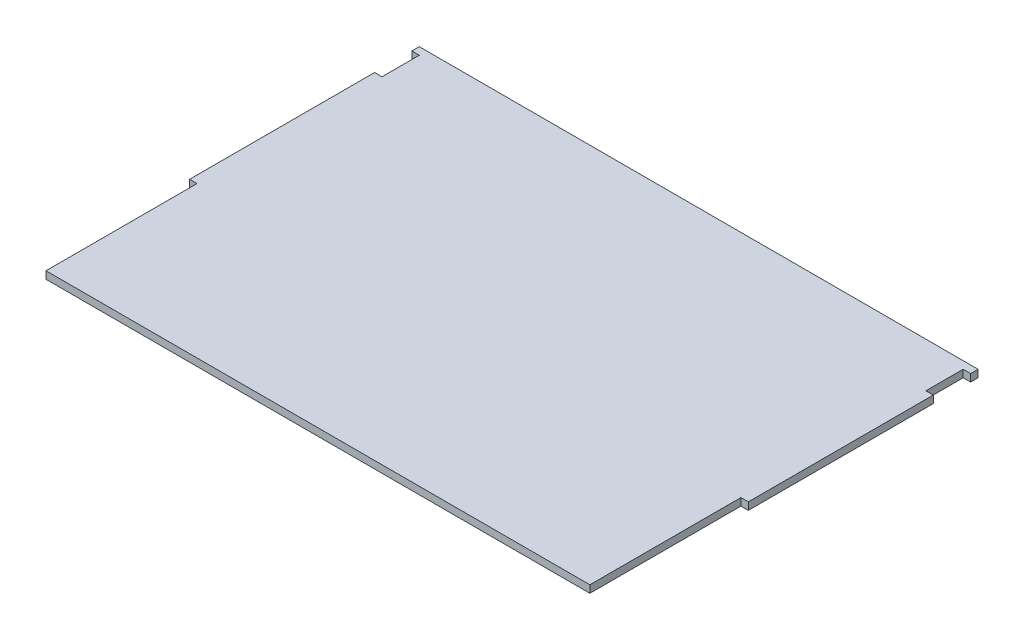
ISO-10303-21;
HEADER;
FILE_DESCRIPTION(('STEP AP214'),'2;1');
FILE_NAME('part.step','',(''),(''),'','','');
FILE_SCHEMA(('AUTOMOTIVE_DESIGN { 1 0 10303 214 1 1 1 1 }'));
ENDSEC;
DATA;
#1=APPLICATION_CONTEXT('core data for automotive mechanical design processes');
#2=APPLICATION_PROTOCOL_DEFINITION('international standard','automotive_design',2000,#1);
#3=PRODUCT_CONTEXT('',#1,'mechanical');
#4=PRODUCT('Part','Part','',(#3));
#5=PRODUCT_RELATED_PRODUCT_CATEGORY('part','',(#4));
#6=PRODUCT_DEFINITION_FORMATION('','',#4);
#7=PRODUCT_DEFINITION_CONTEXT('part definition',#1,'design');
#8=PRODUCT_DEFINITION('design','',#6,#7);
#9=PRODUCT_DEFINITION_SHAPE('','',#8);
#10=(LENGTH_UNIT() NAMED_UNIT(*) SI_UNIT(.MILLI.,.METRE.));
#11=(NAMED_UNIT(*) PLANE_ANGLE_UNIT() SI_UNIT($,.RADIAN.));
#12=(NAMED_UNIT(*) SI_UNIT($,.STERADIAN.) SOLID_ANGLE_UNIT());
#13=UNCERTAINTY_MEASURE_WITH_UNIT(LENGTH_MEASURE(1.E-05),#10,'distance_accuracy_value','');
#14=(GEOMETRIC_REPRESENTATION_CONTEXT(3) GLOBAL_UNCERTAINTY_ASSIGNED_CONTEXT((#13)) GLOBAL_UNIT_ASSIGNED_CONTEXT((#10,
#11,#12)) REPRESENTATION_CONTEXT('',''));
#15=CARTESIAN_POINT('',(0.,0.,0.));
#16=DIRECTION('',(0.,0.,1.));
#17=DIRECTION('',(1.,0.,0.));
#18=AXIS2_PLACEMENT_3D('',#15,#16,#17);
#19=CARTESIAN_POINT('',(220.,3.,0.));
#20=DIRECTION('',(-1.,0.,0.));
#21=DIRECTION('',(0.,0.,1.));
#22=AXIS2_PLACEMENT_3D('',#19,#20,#21);
#23=PLANE('',#22);
#24=DIRECTION('',(0.,0.,-1.));
#25=VECTOR('',#24,1.);
#26=CARTESIAN_POINT('',(220.,3.,0.));
#27=LINE('',#26,#25);
#28=CARTESIAN_POINT('',(220.,3.,-135.910780355686));
#29=VERTEX_POINT('',#28);
#30=CARTESIAN_POINT('',(220.,3.,-151.));
#31=VERTEX_POINT('',#30);
#32=EDGE_CURVE('E48',#29,#31,#27,.T.);
#33=ORIENTED_EDGE('',*,*,#32,.F.);
#34=DIRECTION('',(0.,1.,0.));
#35=VECTOR('',#34,1.);
#36=CARTESIAN_POINT('',(219.999999999992,-74.8827384605226,-135.910780355686));
#37=LINE('',#36,#35);
#38=CARTESIAN_POINT('',(219.999999999992,0.,-135.910780355686));
#39=VERTEX_POINT('',#38);
#40=EDGE_CURVE('E158',#39,#29,#37,.T.);
#41=ORIENTED_EDGE('',*,*,#40,.F.);
#42=DIRECTION('',(0.,0.,-1.));
#43=VECTOR('',#42,1.);
#44=CARTESIAN_POINT('',(220.,0.,0.));
#45=LINE('',#44,#43);
#46=CARTESIAN_POINT('',(220.,0.,-151.));
#47=VERTEX_POINT('',#46);
#48=EDGE_CURVE('E156',#39,#47,#45,.T.);
#49=ORIENTED_EDGE('',*,*,#48,.T.);
#50=DIRECTION('',(0.,-1.,0.));
#51=VECTOR('',#50,1.);
#52=CARTESIAN_POINT('',(220.,3.,-151.));
#53=LINE('',#52,#51);
#54=EDGE_CURVE('E262',#31,#47,#53,.T.);
#55=ORIENTED_EDGE('',*,*,#54,.F.);
#56=EDGE_LOOP('',(#33,#41,#49,#55));
#57=FACE_BOUND('',#56,.T.);
#58=ADVANCED_FACE('F33',(#57),#23,.F.);
#59=CARTESIAN_POINT('',(0.,3.,0.));
#60=DIRECTION('',(1.,0.,0.));
#61=DIRECTION('',(0.,0.,-1.));
#62=AXIS2_PLACEMENT_3D('',#59,#60,#61);
#63=PLANE('',#62);
#64=DIRECTION('',(0.,0.,1.));
#65=VECTOR('',#64,1.);
#66=CARTESIAN_POINT('',(0.,0.,0.));
#67=LINE('',#66,#65);
#68=CARTESIAN_POINT('',(0.,0.,-151.));
#69=VERTEX_POINT('',#68);
#70=CARTESIAN_POINT('',(0.,0.,-135.910780355691));
#71=VERTEX_POINT('',#70);
#72=EDGE_CURVE('E231',#69,#71,#67,.T.);
#73=ORIENTED_EDGE('',*,*,#72,.T.);
#74=DIRECTION('',(0.,1.,0.));
#75=VECTOR('',#74,1.);
#76=CARTESIAN_POINT('',(6.68735899989059E-13,-74.8827384605226,-135.910780355691));
#77=LINE('',#76,#75);
#78=CARTESIAN_POINT('',(0.,3.,-135.910780355691));
#79=VERTEX_POINT('',#78);
#80=EDGE_CURVE('E188',#71,#79,#77,.T.);
#81=ORIENTED_EDGE('',*,*,#80,.T.);
#82=DIRECTION('',(0.,0.,1.));
#83=VECTOR('',#82,1.);
#84=CARTESIAN_POINT('',(0.,3.,0.));
#85=LINE('',#84,#83);
#86=CARTESIAN_POINT('',(0.,3.,-151.));
#87=VERTEX_POINT('',#86);
#88=EDGE_CURVE('E212',#87,#79,#85,.T.);
#89=ORIENTED_EDGE('',*,*,#88,.F.);
#90=DIRECTION('',(0.,-1.,0.));
#91=VECTOR('',#90,1.);
#92=CARTESIAN_POINT('',(0.,3.,-151.));
#93=LINE('',#92,#91);
#94=EDGE_CURVE('E230',#87,#69,#93,.T.);
#95=ORIENTED_EDGE('',*,*,#94,.T.);
#96=EDGE_LOOP('',(#73,#81,#89,#95));
#97=FACE_BOUND('',#96,.T.);
#98=ADVANCED_FACE('F327',(#97),#63,.F.);
#99=CARTESIAN_POINT('',(0.,3.,-61.0881599835933));
#100=VERTEX_POINT('',#99);
#101=CARTESIAN_POINT('',(0.,3.,0.));
#102=VERTEX_POINT('',#101);
#103=EDGE_CURVE('E216',#100,#102,#85,.T.);
#104=ORIENTED_EDGE('',*,*,#103,.F.);
#105=DIRECTION('',(0.,1.,0.));
#106=VECTOR('',#105,1.);
#107=CARTESIAN_POINT('',(2.64545330086463E-13,-74.8827384605226,-61.0881599835933));
#108=LINE('',#107,#106);
#109=CARTESIAN_POINT('',(2.64545330086463E-13,0.,-61.0881599835933));
#110=VERTEX_POINT('',#109);
#111=EDGE_CURVE('E197',#110,#100,#108,.T.);
#112=ORIENTED_EDGE('',*,*,#111,.F.);
#113=CARTESIAN_POINT('',(0.,0.,0.));
#114=VERTEX_POINT('',#113);
#115=EDGE_CURVE('E211',#110,#114,#67,.T.);
#116=ORIENTED_EDGE('',*,*,#115,.T.);
#117=DIRECTION('',(0.,-1.,0.));
#118=VECTOR('',#117,1.);
#119=CARTESIAN_POINT('',(0.,3.,0.));
#120=LINE('',#119,#118);
#121=EDGE_CURVE('E11',#102,#114,#120,.T.);
#122=ORIENTED_EDGE('',*,*,#121,.F.);
#123=EDGE_LOOP('',(#104,#112,#116,#122));
#124=FACE_BOUND('',#123,.T.);
#125=ADVANCED_FACE('F35',(#124),#63,.F.);
#126=CARTESIAN_POINT('',(0.,3.,0.));
#127=DIRECTION('',(0.,0.,-1.));
#128=DIRECTION('',(-1.,0.,0.));
#129=AXIS2_PLACEMENT_3D('',#126,#127,#128);
#130=PLANE('',#129);
#131=DIRECTION('',(1.,0.,0.));
#132=VECTOR('',#131,1.);
#133=CARTESIAN_POINT('',(0.,0.,0.));
#134=LINE('',#133,#132);
#135=CARTESIAN_POINT('',(220.,0.,0.));
#136=VERTEX_POINT('',#135);
#137=EDGE_CURVE('E233',#114,#136,#134,.T.);
#138=ORIENTED_EDGE('',*,*,#137,.T.);
#139=DIRECTION('',(0.,-1.,0.));
#140=VECTOR('',#139,1.);
#141=CARTESIAN_POINT('',(220.,3.,0.));
#142=LINE('',#141,#140);
#143=CARTESIAN_POINT('',(220.,3.,0.));
#144=VERTEX_POINT('',#143);
#145=EDGE_CURVE('E41',#144,#136,#142,.T.);
#146=ORIENTED_EDGE('',*,*,#145,.F.);
#147=DIRECTION('',(1.,0.,0.));
#148=VECTOR('',#147,1.);
#149=CARTESIAN_POINT('',(0.,3.,0.));
#150=LINE('',#149,#148);
#151=EDGE_CURVE('E215',#102,#144,#150,.T.);
#152=ORIENTED_EDGE('',*,*,#151,.F.);
#153=ORIENTED_EDGE('',*,*,#121,.T.);
#154=EDGE_LOOP('',(#138,#146,#152,#153));
#155=FACE_BOUND('',#154,.T.);
#156=ADVANCED_FACE('F318',(#155),#130,.F.);
#157=CARTESIAN_POINT('',(220.,0.,-61.0881599835888));
#158=VERTEX_POINT('',#157);
#159=EDGE_CURVE('E235',#136,#158,#45,.T.);
#160=ORIENTED_EDGE('',*,*,#159,.T.);
#161=DIRECTION('',(0.,1.,0.));
#162=VECTOR('',#161,1.);
#163=CARTESIAN_POINT('',(219.999999999991,-74.8827384605226,-61.0881599835888));
#164=LINE('',#163,#162);
#165=CARTESIAN_POINT('',(220.,3.,-61.0881599835888));
#166=VERTEX_POINT('',#165);
#167=EDGE_CURVE('E56',#158,#166,#164,.T.);
#168=ORIENTED_EDGE('',*,*,#167,.T.);
#169=EDGE_CURVE('E218',#144,#166,#27,.T.);
#170=ORIENTED_EDGE('',*,*,#169,.F.);
#171=ORIENTED_EDGE('',*,*,#145,.T.);
#172=EDGE_LOOP('',(#160,#168,#170,#171));
#173=FACE_BOUND('',#172,.T.);
#174=ADVANCED_FACE('F267',(#173),#23,.F.);
#175=CARTESIAN_POINT('',(223.,3.,-151.));
#176=DIRECTION('',(0.,0.,-1.));
#177=DIRECTION('',(-1.,0.,0.));
#178=AXIS2_PLACEMENT_3D('',#175,#176,#177);
#179=PLANE('',#178);
#180=DIRECTION('',(1.,0.,0.));
#181=VECTOR('',#180,1.);
#182=CARTESIAN_POINT('',(223.,0.,-151.));
#183=LINE('',#182,#181);
#184=CARTESIAN_POINT('',(223.,0.,-151.));
#185=VERTEX_POINT('',#184);
#186=EDGE_CURVE('E237',#47,#185,#183,.T.);
#187=ORIENTED_EDGE('',*,*,#186,.T.);
#188=DIRECTION('',(0.,-1.,0.));
#189=VECTOR('',#188,1.);
#190=CARTESIAN_POINT('',(223.,3.,-151.));
#191=LINE('',#190,#189);
#192=CARTESIAN_POINT('',(223.,3.,-151.));
#193=VERTEX_POINT('',#192);
#194=EDGE_CURVE('E259',#193,#185,#191,.T.);
#195=ORIENTED_EDGE('',*,*,#194,.F.);
#196=DIRECTION('',(1.,0.,0.));
#197=VECTOR('',#196,1.);
#198=CARTESIAN_POINT('',(223.,3.,-151.));
#199=LINE('',#198,#197);
#200=EDGE_CURVE('E220',#31,#193,#199,.T.);
#201=ORIENTED_EDGE('',*,*,#200,.F.);
#202=ORIENTED_EDGE('',*,*,#54,.T.);
#203=EDGE_LOOP('',(#187,#195,#201,#202));
#204=FACE_BOUND('',#203,.T.);
#205=ADVANCED_FACE('F280',(#204),#179,.F.);
#206=CARTESIAN_POINT('',(223.,3.,-154.));
#207=DIRECTION('',(-1.,0.,0.));
#208=DIRECTION('',(0.,0.,1.));
#209=AXIS2_PLACEMENT_3D('',#206,#207,#208);
#210=PLANE('',#209);
#211=DIRECTION('',(0.,0.,-1.));
#212=VECTOR('',#211,1.);
#213=CARTESIAN_POINT('',(223.,0.,-154.));
#214=LINE('',#213,#212);
#215=CARTESIAN_POINT('',(223.,0.,-154.));
#216=VERTEX_POINT('',#215);
#217=EDGE_CURVE('E239',#185,#216,#214,.T.);
#218=ORIENTED_EDGE('',*,*,#217,.T.);
#219=DIRECTION('',(0.,-1.,0.));
#220=VECTOR('',#219,1.);
#221=CARTESIAN_POINT('',(223.,3.,-154.));
#222=LINE('',#221,#220);
#223=CARTESIAN_POINT('',(223.,3.,-154.));
#224=VERTEX_POINT('',#223);
#225=EDGE_CURVE('E256',#224,#216,#222,.T.);
#226=ORIENTED_EDGE('',*,*,#225,.F.);
#227=DIRECTION('',(0.,0.,-1.));
#228=VECTOR('',#227,1.);
#229=CARTESIAN_POINT('',(223.,3.,-154.));
#230=LINE('',#229,#228);
#231=EDGE_CURVE('E222',#193,#224,#230,.T.);
#232=ORIENTED_EDGE('',*,*,#231,.F.);
#233=ORIENTED_EDGE('',*,*,#194,.T.);
#234=EDGE_LOOP('',(#218,#226,#232,#233));
#235=FACE_BOUND('',#234,.T.);
#236=ADVANCED_FACE('F285',(#235),#210,.F.);
#237=CARTESIAN_POINT('',(0.,3.,-154.));
#238=DIRECTION('',(0.,0.,1.));
#239=DIRECTION('',(1.,0.,0.));
#240=AXIS2_PLACEMENT_3D('',#237,#238,#239);
#241=PLANE('',#240);
#242=DIRECTION('',(-1.,0.,0.));
#243=VECTOR('',#242,1.);
#244=CARTESIAN_POINT('',(0.,0.,-154.));
#245=LINE('',#244,#243);
#246=CARTESIAN_POINT('',(-3.00000000000002,0.,-154.));
#247=VERTEX_POINT('',#246);
#248=EDGE_CURVE('E242',#216,#247,#245,.T.);
#249=ORIENTED_EDGE('',*,*,#248,.T.);
#250=DIRECTION('',(0.,-1.,0.));
#251=VECTOR('',#250,1.);
#252=CARTESIAN_POINT('',(-3.00000000000002,3.,-154.));
#253=LINE('',#252,#251);
#254=CARTESIAN_POINT('',(-3.00000000000002,3.,-154.));
#255=VERTEX_POINT('',#254);
#256=EDGE_CURVE('E253',#255,#247,#253,.T.);
#257=ORIENTED_EDGE('',*,*,#256,.F.);
#258=DIRECTION('',(-1.,0.,0.));
#259=VECTOR('',#258,1.);
#260=CARTESIAN_POINT('',(220.,3.,-154.));
#261=LINE('',#260,#259);
#262=EDGE_CURVE('E224',#224,#255,#261,.T.);
#263=ORIENTED_EDGE('',*,*,#262,.F.);
#264=ORIENTED_EDGE('',*,*,#225,.T.);
#265=EDGE_LOOP('',(#249,#257,#263,#264));
#266=FACE_BOUND('',#265,.T.);
#267=ADVANCED_FACE('F291',(#266),#241,.F.);
#268=CARTESIAN_POINT('',(-3.00000000000002,3.,-154.));
#269=DIRECTION('',(1.,0.,0.));
#270=DIRECTION('',(0.,0.,-1.));
#271=AXIS2_PLACEMENT_3D('',#268,#269,#270);
#272=PLANE('',#271);
#273=DIRECTION('',(0.,0.,1.));
#274=VECTOR('',#273,1.);
#275=CARTESIAN_POINT('',(-3.00000000000002,0.,-154.));
#276=LINE('',#275,#274);
#277=CARTESIAN_POINT('',(-3.00000000000002,0.,-151.));
#278=VERTEX_POINT('',#277);
#279=EDGE_CURVE('E244',#247,#278,#276,.T.);
#280=ORIENTED_EDGE('',*,*,#279,.T.);
#281=DIRECTION('',(0.,-1.,0.));
#282=VECTOR('',#281,1.);
#283=CARTESIAN_POINT('',(-3.00000000000002,3.,-151.));
#284=LINE('',#283,#282);
#285=CARTESIAN_POINT('',(-3.00000000000002,3.,-151.));
#286=VERTEX_POINT('',#285);
#287=EDGE_CURVE('E250',#286,#278,#284,.T.);
#288=ORIENTED_EDGE('',*,*,#287,.F.);
#289=DIRECTION('',(0.,0.,1.));
#290=VECTOR('',#289,1.);
#291=CARTESIAN_POINT('',(-3.00000000000002,3.,-154.));
#292=LINE('',#291,#290);
#293=EDGE_CURVE('E226',#255,#286,#292,.T.);
#294=ORIENTED_EDGE('',*,*,#293,.F.);
#295=ORIENTED_EDGE('',*,*,#256,.T.);
#296=EDGE_LOOP('',(#280,#288,#294,#295));
#297=FACE_BOUND('',#296,.T.);
#298=ADVANCED_FACE('F294',(#297),#272,.F.);
#299=CARTESIAN_POINT('',(-3.00000000000002,3.,-151.));
#300=DIRECTION('',(0.,0.,-1.));
#301=DIRECTION('',(-1.,0.,0.));
#302=AXIS2_PLACEMENT_3D('',#299,#300,#301);
#303=PLANE('',#302);
#304=DIRECTION('',(1.,0.,0.));
#305=VECTOR('',#304,1.);
#306=CARTESIAN_POINT('',(-3.00000000000002,0.,-151.));
#307=LINE('',#306,#305);
#308=EDGE_CURVE('E246',#278,#69,#307,.T.);
#309=ORIENTED_EDGE('',*,*,#308,.T.);
#310=ORIENTED_EDGE('',*,*,#94,.F.);
#311=DIRECTION('',(1.,0.,0.));
#312=VECTOR('',#311,1.);
#313=CARTESIAN_POINT('',(-3.00000000000002,3.,-151.));
#314=LINE('',#313,#312);
#315=EDGE_CURVE('E228',#286,#87,#314,.T.);
#316=ORIENTED_EDGE('',*,*,#315,.F.);
#317=ORIENTED_EDGE('',*,*,#287,.T.);
#318=EDGE_LOOP('',(#309,#310,#316,#317));
#319=FACE_BOUND('',#318,.T.);
#320=ADVANCED_FACE('F299',(#319),#303,.F.);
#321=CARTESIAN_POINT('',(0.,3.,0.));
#322=DIRECTION('',(0.,-1.,0.));
#323=DIRECTION('',(0.,0.,-1.));
#324=AXIS2_PLACEMENT_3D('',#321,#322,#323);
#325=PLANE('',#324);
#326=ORIENTED_EDGE('',*,*,#88,.T.);
#327=DIRECTION('',(-1.,0.,0.));
#328=VECTOR('',#327,1.);
#329=CARTESIAN_POINT('',(6.68735899989059E-13,3.,-135.910780355691));
#330=LINE('',#329,#328);
#331=CARTESIAN_POINT('',(-2.99999999999933,3.,-135.910780355691));
#332=VERTEX_POINT('',#331);
#333=EDGE_CURVE('E189',#79,#332,#330,.T.);
#334=ORIENTED_EDGE('',*,*,#333,.T.);
#335=DIRECTION('',(0.,0.,1.));
#336=VECTOR('',#335,1.);
#337=CARTESIAN_POINT('',(-2.99999999999933,3.,-135.910780355691));
#338=LINE('',#337,#336);
#339=CARTESIAN_POINT('',(-2.99999999999974,3.,-61.0881599835933));
#340=VERTEX_POINT('',#339);
#341=EDGE_CURVE('E185',#332,#340,#338,.T.);
#342=ORIENTED_EDGE('',*,*,#341,.T.);
#343=DIRECTION('',(1.,0.,0.));
#344=VECTOR('',#343,1.);
#345=CARTESIAN_POINT('',(-2.99999999999974,3.,-61.0881599835933));
#346=LINE('',#345,#344);
#347=EDGE_CURVE('E184',#340,#100,#346,.T.);
#348=ORIENTED_EDGE('',*,*,#347,.T.);
#349=ORIENTED_EDGE('',*,*,#103,.T.);
#350=ORIENTED_EDGE('',*,*,#151,.T.);
#351=ORIENTED_EDGE('',*,*,#169,.T.);
#352=DIRECTION('',(1.,0.,0.));
#353=VECTOR('',#352,1.);
#354=CARTESIAN_POINT('',(219.999999999991,3.,-61.0881599835888));
#355=LINE('',#354,#353);
#356=CARTESIAN_POINT('',(222.999999999991,3.,-61.0881599835888));
#357=VERTEX_POINT('',#356);
#358=EDGE_CURVE('E177',#166,#357,#355,.T.);
#359=ORIENTED_EDGE('',*,*,#358,.T.);
#360=DIRECTION('',(0.,0.,-1.));
#361=VECTOR('',#360,1.);
#362=CARTESIAN_POINT('',(222.999999999991,3.,-61.0881599835888));
#363=LINE('',#362,#361);
#364=CARTESIAN_POINT('',(222.999999999992,3.,-135.910780355686));
#365=VERTEX_POINT('',#364);
#366=EDGE_CURVE('E173',#357,#365,#363,.T.);
#367=ORIENTED_EDGE('',*,*,#366,.T.);
#368=DIRECTION('',(-1.,0.,0.));
#369=VECTOR('',#368,1.);
#370=CARTESIAN_POINT('',(222.999999999992,3.,-135.910780355686));
#371=LINE('',#370,#369);
#372=EDGE_CURVE('E164',#365,#29,#371,.T.);
#373=ORIENTED_EDGE('',*,*,#372,.T.);
#374=ORIENTED_EDGE('',*,*,#32,.T.);
#375=ORIENTED_EDGE('',*,*,#200,.T.);
#376=ORIENTED_EDGE('',*,*,#231,.T.);
#377=ORIENTED_EDGE('',*,*,#262,.T.);
#378=ORIENTED_EDGE('',*,*,#293,.T.);
#379=ORIENTED_EDGE('',*,*,#315,.T.);
#380=EDGE_LOOP('',(#326,#334,#342,#348,#349,#350,#351,#359,#367,#373,#374,#375,#376,#377,#378,#379));
#381=FACE_BOUND('',#380,.T.);
#382=ADVANCED_FACE('F276',(#381),#325,.F.);
#383=CARTESIAN_POINT('',(0.,0.,0.));
#384=DIRECTION('',(0.,-1.,0.));
#385=DIRECTION('',(0.,0.,-1.));
#386=AXIS2_PLACEMENT_3D('',#383,#384,#385);
#387=PLANE('',#386);
#388=ORIENTED_EDGE('',*,*,#72,.F.);
#389=ORIENTED_EDGE('',*,*,#308,.F.);
#390=ORIENTED_EDGE('',*,*,#279,.F.);
#391=ORIENTED_EDGE('',*,*,#248,.F.);
#392=ORIENTED_EDGE('',*,*,#217,.F.);
#393=ORIENTED_EDGE('',*,*,#186,.F.);
#394=ORIENTED_EDGE('',*,*,#48,.F.);
#395=DIRECTION('',(-1.,0.,0.));
#396=VECTOR('',#395,1.);
#397=CARTESIAN_POINT('',(222.999999999992,0.,-135.910780355686));
#398=LINE('',#397,#396);
#399=CARTESIAN_POINT('',(222.999999999992,0.,-135.910780355686));
#400=VERTEX_POINT('',#399);
#401=EDGE_CURVE('E147',#400,#39,#398,.T.);
#402=ORIENTED_EDGE('',*,*,#401,.F.);
#403=DIRECTION('',(0.,0.,-1.));
#404=VECTOR('',#403,1.);
#405=CARTESIAN_POINT('',(222.999999999991,0.,-61.0881599835888));
#406=LINE('',#405,#404);
#407=CARTESIAN_POINT('',(222.999999999991,0.,-61.0881599835888));
#408=VERTEX_POINT('',#407);
#409=EDGE_CURVE('E153',#408,#400,#406,.T.);
#410=ORIENTED_EDGE('',*,*,#409,.F.);
#411=DIRECTION('',(1.,0.,0.));
#412=VECTOR('',#411,1.);
#413=CARTESIAN_POINT('',(219.999999999991,0.,-61.0881599835888));
#414=LINE('',#413,#412);
#415=EDGE_CURVE('E179',#158,#408,#414,.T.);
#416=ORIENTED_EDGE('',*,*,#415,.F.);
#417=ORIENTED_EDGE('',*,*,#159,.F.);
#418=ORIENTED_EDGE('',*,*,#137,.F.);
#419=ORIENTED_EDGE('',*,*,#115,.F.);
#420=DIRECTION('',(1.,0.,0.));
#421=VECTOR('',#420,1.);
#422=CARTESIAN_POINT('',(-2.99999999999974,0.,-61.0881599835933));
#423=LINE('',#422,#421);
#424=CARTESIAN_POINT('',(-2.99999999999974,0.,-61.0881599835933));
#425=VERTEX_POINT('',#424);
#426=EDGE_CURVE('E194',#425,#110,#423,.T.);
#427=ORIENTED_EDGE('',*,*,#426,.F.);
#428=DIRECTION('',(0.,0.,1.));
#429=VECTOR('',#428,1.);
#430=CARTESIAN_POINT('',(-2.99999999999933,0.,-135.910780355691));
#431=LINE('',#430,#429);
#432=CARTESIAN_POINT('',(-2.99999999999933,0.,-135.910780355691));
#433=VERTEX_POINT('',#432);
#434=EDGE_CURVE('E199',#433,#425,#431,.T.);
#435=ORIENTED_EDGE('',*,*,#434,.F.);
#436=DIRECTION('',(-1.,0.,0.));
#437=VECTOR('',#436,1.);
#438=CARTESIAN_POINT('',(6.68735899989059E-13,0.,-135.910780355691));
#439=LINE('',#438,#437);
#440=EDGE_CURVE('E203',#71,#433,#439,.T.);
#441=ORIENTED_EDGE('',*,*,#440,.F.);
#442=EDGE_LOOP('',(#388,#389,#390,#391,#392,#393,#394,#402,#410,#416,#417,#418,#419,#427,#435,#441));
#443=FACE_BOUND('',#442,.T.);
#444=ADVANCED_FACE('F150',(#443),#387,.T.);
#445=CARTESIAN_POINT('',(6.68735899989059E-13,-74.8827384605226,-135.910780355691));
#446=DIRECTION('',(0.,0.,-1.));
#447=DIRECTION('',(-1.,0.,0.));
#448=AXIS2_PLACEMENT_3D('',#445,#446,#447);
#449=PLANE('',#448);
#450=ORIENTED_EDGE('',*,*,#80,.F.);
#451=ORIENTED_EDGE('',*,*,#440,.T.);
#452=DIRECTION('',(0.,1.,0.));
#453=VECTOR('',#452,1.);
#454=CARTESIAN_POINT('',(-2.99999999999933,-74.8827384605226,-135.910780355691));
#455=LINE('',#454,#453);
#456=EDGE_CURVE('E202',#433,#332,#455,.T.);
#457=ORIENTED_EDGE('',*,*,#456,.T.);
#458=ORIENTED_EDGE('',*,*,#333,.F.);
#459=EDGE_LOOP('',(#450,#451,#457,#458));
#460=FACE_BOUND('',#459,.T.);
#461=ADVANCED_FACE('F306',(#460),#449,.T.);
#462=CARTESIAN_POINT('',(-2.99999999999933,-74.8827384605226,-135.910780355691));
#463=DIRECTION('',(-1.,0.,0.));
#464=DIRECTION('',(0.,0.,1.));
#465=AXIS2_PLACEMENT_3D('',#462,#463,#464);
#466=PLANE('',#465);
#467=ORIENTED_EDGE('',*,*,#456,.F.);
#468=ORIENTED_EDGE('',*,*,#434,.T.);
#469=DIRECTION('',(0.,1.,0.));
#470=VECTOR('',#469,1.);
#471=CARTESIAN_POINT('',(-2.99999999999974,-74.8827384605226,-61.0881599835933));
#472=LINE('',#471,#470);
#473=EDGE_CURVE('E198',#425,#340,#472,.T.);
#474=ORIENTED_EDGE('',*,*,#473,.T.);
#475=ORIENTED_EDGE('',*,*,#341,.F.);
#476=EDGE_LOOP('',(#467,#468,#474,#475));
#477=FACE_BOUND('',#476,.T.);
#478=ADVANCED_FACE('F310',(#477),#466,.T.);
#479=CARTESIAN_POINT('',(-2.99999999999974,-74.8827384605226,-61.0881599835933));
#480=DIRECTION('',(0.,0.,1.));
#481=DIRECTION('',(1.,0.,0.));
#482=AXIS2_PLACEMENT_3D('',#479,#480,#481);
#483=PLANE('',#482);
#484=ORIENTED_EDGE('',*,*,#473,.F.);
#485=ORIENTED_EDGE('',*,*,#426,.T.);
#486=ORIENTED_EDGE('',*,*,#111,.T.);
#487=ORIENTED_EDGE('',*,*,#347,.F.);
#488=EDGE_LOOP('',(#484,#485,#486,#487));
#489=FACE_BOUND('',#488,.T.);
#490=ADVANCED_FACE('F314',(#489),#483,.T.);
#491=CARTESIAN_POINT('',(222.999999999991,-74.8827384605226,-61.0881599835888));
#492=DIRECTION('',(1.,0.,0.));
#493=DIRECTION('',(0.,0.,-1.));
#494=AXIS2_PLACEMENT_3D('',#491,#492,#493);
#495=PLANE('',#494);
#496=DIRECTION('',(0.,1.,0.));
#497=VECTOR('',#496,1.);
#498=CARTESIAN_POINT('',(222.999999999991,-74.8827384605226,-61.0881599835888));
#499=LINE('',#498,#497);
#500=EDGE_CURVE('E171',#408,#357,#499,.T.);
#501=ORIENTED_EDGE('',*,*,#500,.F.);
#502=ORIENTED_EDGE('',*,*,#409,.T.);
#503=DIRECTION('',(0.,1.,0.));
#504=VECTOR('',#503,1.);
#505=CARTESIAN_POINT('',(222.999999999992,-74.8827384605226,-135.910780355686));
#506=LINE('',#505,#504);
#507=EDGE_CURVE('E159',#400,#365,#506,.T.);
#508=ORIENTED_EDGE('',*,*,#507,.T.);
#509=ORIENTED_EDGE('',*,*,#366,.F.);
#510=EDGE_LOOP('',(#501,#502,#508,#509));
#511=FACE_BOUND('',#510,.T.);
#512=ADVANCED_FACE('F170',(#511),#495,.T.);
#513=CARTESIAN_POINT('',(222.999999999992,-74.8827384605226,-135.910780355686));
#514=DIRECTION('',(0.,0.,-1.));
#515=DIRECTION('',(-1.,0.,0.));
#516=AXIS2_PLACEMENT_3D('',#513,#514,#515);
#517=PLANE('',#516);
#518=ORIENTED_EDGE('',*,*,#507,.F.);
#519=ORIENTED_EDGE('',*,*,#401,.T.);
#520=ORIENTED_EDGE('',*,*,#40,.T.);
#521=ORIENTED_EDGE('',*,*,#372,.F.);
#522=EDGE_LOOP('',(#518,#519,#520,#521));
#523=FACE_BOUND('',#522,.T.);
#524=ADVANCED_FACE('F162',(#523),#517,.T.);
#525=CARTESIAN_POINT('',(219.999999999991,-74.8827384605226,-61.0881599835888));
#526=DIRECTION('',(0.,0.,1.));
#527=DIRECTION('',(1.,0.,0.));
#528=AXIS2_PLACEMENT_3D('',#525,#526,#527);
#529=PLANE('',#528);
#530=ORIENTED_EDGE('',*,*,#167,.F.);
#531=ORIENTED_EDGE('',*,*,#415,.T.);
#532=ORIENTED_EDGE('',*,*,#500,.T.);
#533=ORIENTED_EDGE('',*,*,#358,.F.);
#534=EDGE_LOOP('',(#530,#531,#532,#533));
#535=FACE_BOUND('',#534,.T.);
#536=ADVANCED_FACE('F273',(#535),#529,.T.);
#537=CLOSED_SHELL('',(#58,#98,#125,#156,#174,#205,#236,#267,#298,#320,#382,#444,#461,#478,#490,
#512,#524,#536));
#538=MANIFOLD_SOLID_BREP('B2',#537);
#539=ADVANCED_BREP_SHAPE_REPRESENTATION('',(#18,#538),#14);
#540=SHAPE_DEFINITION_REPRESENTATION(#9,#539);
ENDSEC;
END-ISO-10303-21;
